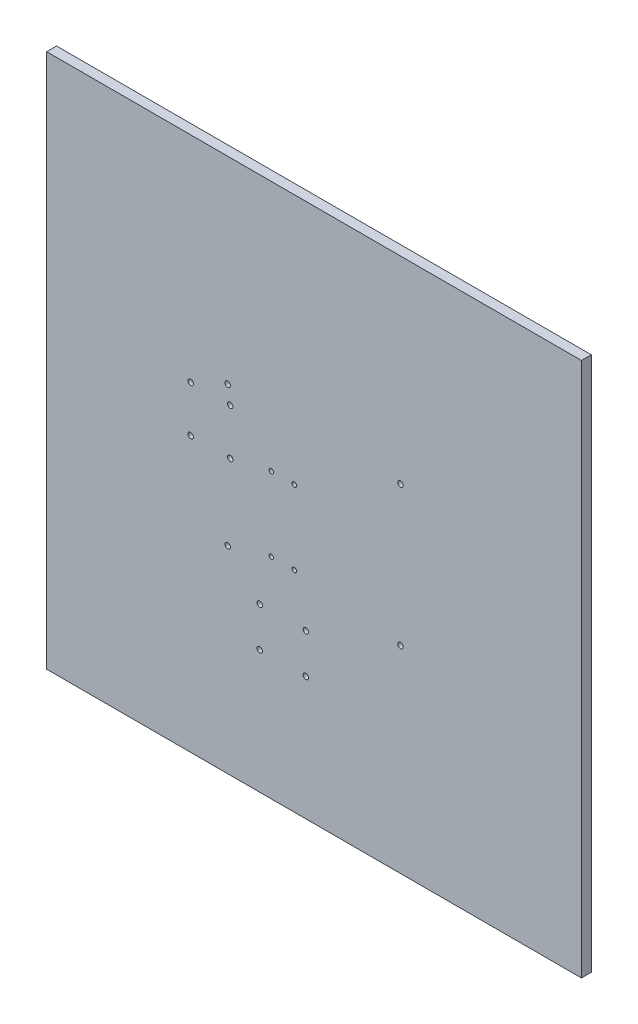
ISO-10303-21;
HEADER;
FILE_DESCRIPTION(('STEP AP214'),'2;1');
FILE_NAME('part.step','',(''),(''),'','','');
FILE_SCHEMA(('AUTOMOTIVE_DESIGN { 1 0 10303 214 1 1 1 1 }'));
ENDSEC;
DATA;
#1=APPLICATION_CONTEXT('core data for automotive mechanical design processes');
#2=APPLICATION_PROTOCOL_DEFINITION('international standard','automotive_design',2000,#1);
#3=PRODUCT_CONTEXT('',#1,'mechanical');
#4=PRODUCT('Part','Part','',(#3));
#5=PRODUCT_RELATED_PRODUCT_CATEGORY('part','',(#4));
#6=PRODUCT_DEFINITION_FORMATION('','',#4);
#7=PRODUCT_DEFINITION_CONTEXT('part definition',#1,'design');
#8=PRODUCT_DEFINITION('design','',#6,#7);
#9=PRODUCT_DEFINITION_SHAPE('','',#8);
#10=(LENGTH_UNIT() NAMED_UNIT(*) SI_UNIT(.MILLI.,.METRE.));
#11=(NAMED_UNIT(*) PLANE_ANGLE_UNIT() SI_UNIT($,.RADIAN.));
#12=(NAMED_UNIT(*) SI_UNIT($,.STERADIAN.) SOLID_ANGLE_UNIT());
#13=UNCERTAINTY_MEASURE_WITH_UNIT(LENGTH_MEASURE(1.E-05),#10,'distance_accuracy_value','');
#14=(GEOMETRIC_REPRESENTATION_CONTEXT(3) GLOBAL_UNCERTAINTY_ASSIGNED_CONTEXT((#13)) GLOBAL_UNIT_ASSIGNED_CONTEXT((#10,
#11,#12)) REPRESENTATION_CONTEXT('',''));
#15=CARTESIAN_POINT('',(0.,0.,0.));
#16=DIRECTION('',(0.,0.,1.));
#17=DIRECTION('',(1.,0.,0.));
#18=AXIS2_PLACEMENT_3D('',#15,#16,#17);
#19=CARTESIAN_POINT('',(-325.,-325.,12.));
#20=DIRECTION('',(1.,0.,0.));
#21=DIRECTION('',(0.,0.,-1.));
#22=AXIS2_PLACEMENT_3D('',#19,#20,#21);
#23=PLANE('',#22);
#24=DIRECTION('',(0.,-1.,0.));
#25=VECTOR('',#24,1.);
#26=CARTESIAN_POINT('',(-325.,-325.,0.));
#27=LINE('',#26,#25);
#28=CARTESIAN_POINT('',(-325.,325.,0.));
#29=VERTEX_POINT('',#28);
#30=CARTESIAN_POINT('',(-325.,-325.,0.));
#31=VERTEX_POINT('',#30);
#32=EDGE_CURVE('E102',#29,#31,#27,.T.);
#33=ORIENTED_EDGE('',*,*,#32,.T.);
#34=DIRECTION('',(0.,0.,-1.));
#35=VECTOR('',#34,1.);
#36=CARTESIAN_POINT('',(-325.,-325.,12.));
#37=LINE('',#36,#35);
#38=CARTESIAN_POINT('',(-325.,-325.,12.));
#39=VERTEX_POINT('',#38);
#40=EDGE_CURVE('E11',#39,#31,#37,.T.);
#41=ORIENTED_EDGE('',*,*,#40,.F.);
#42=DIRECTION('',(0.,-1.,0.));
#43=VECTOR('',#42,1.);
#44=CARTESIAN_POINT('',(-325.,-325.,12.));
#45=LINE('',#44,#43);
#46=CARTESIAN_POINT('',(-325.,325.,12.));
#47=VERTEX_POINT('',#46);
#48=EDGE_CURVE('E95',#47,#39,#45,.T.);
#49=ORIENTED_EDGE('',*,*,#48,.F.);
#50=DIRECTION('',(0.,0.,-1.));
#51=VECTOR('',#50,1.);
#52=CARTESIAN_POINT('',(-325.,325.,12.));
#53=LINE('',#52,#51);
#54=EDGE_CURVE('E99',#47,#29,#53,.T.);
#55=ORIENTED_EDGE('',*,*,#54,.T.);
#56=EDGE_LOOP('',(#33,#41,#49,#55));
#57=FACE_BOUND('',#56,.T.);
#58=ADVANCED_FACE('F41',(#57),#23,.F.);
#59=CARTESIAN_POINT('',(-325.,-325.,12.));
#60=DIRECTION('',(0.,1.,0.));
#61=DIRECTION('',(0.,0.,1.));
#62=AXIS2_PLACEMENT_3D('',#59,#60,#61);
#63=PLANE('',#62);
#64=DIRECTION('',(1.,0.,0.));
#65=VECTOR('',#64,1.);
#66=CARTESIAN_POINT('',(-325.,-325.,0.));
#67=LINE('',#66,#65);
#68=CARTESIAN_POINT('',(325.,-325.,0.));
#69=VERTEX_POINT('',#68);
#70=EDGE_CURVE('E96',#31,#69,#67,.T.);
#71=ORIENTED_EDGE('',*,*,#70,.T.);
#72=DIRECTION('',(0.,0.,-1.));
#73=VECTOR('',#72,1.);
#74=CARTESIAN_POINT('',(325.,-325.,12.));
#75=LINE('',#74,#73);
#76=CARTESIAN_POINT('',(325.,-325.,12.));
#77=VERTEX_POINT('',#76);
#78=EDGE_CURVE('E47',#77,#69,#75,.T.);
#79=ORIENTED_EDGE('',*,*,#78,.F.);
#80=DIRECTION('',(1.,0.,0.));
#81=VECTOR('',#80,1.);
#82=CARTESIAN_POINT('',(-325.,-325.,12.));
#83=LINE('',#82,#81);
#84=EDGE_CURVE('E87',#39,#77,#83,.T.);
#85=ORIENTED_EDGE('',*,*,#84,.F.);
#86=ORIENTED_EDGE('',*,*,#40,.T.);
#87=EDGE_LOOP('',(#71,#79,#85,#86));
#88=FACE_BOUND('',#87,.T.);
#89=ADVANCED_FACE('F92',(#88),#63,.F.);
#90=CARTESIAN_POINT('',(325.,-325.,12.));
#91=DIRECTION('',(-1.,0.,0.));
#92=DIRECTION('',(0.,0.,1.));
#93=AXIS2_PLACEMENT_3D('',#90,#91,#92);
#94=PLANE('',#93);
#95=DIRECTION('',(0.,1.,0.));
#96=VECTOR('',#95,1.);
#97=CARTESIAN_POINT('',(325.,-325.,0.));
#98=LINE('',#97,#96);
#99=CARTESIAN_POINT('',(325.,325.,0.));
#100=VERTEX_POINT('',#99);
#101=EDGE_CURVE('E74',#69,#100,#98,.T.);
#102=ORIENTED_EDGE('',*,*,#101,.T.);
#103=DIRECTION('',(0.,0.,-1.));
#104=VECTOR('',#103,1.);
#105=CARTESIAN_POINT('',(325.,325.,12.));
#106=LINE('',#105,#104);
#107=CARTESIAN_POINT('',(325.,325.,12.));
#108=VERTEX_POINT('',#107);
#109=EDGE_CURVE('E100',#108,#100,#106,.T.);
#110=ORIENTED_EDGE('',*,*,#109,.F.);
#111=DIRECTION('',(0.,1.,0.));
#112=VECTOR('',#111,1.);
#113=CARTESIAN_POINT('',(325.,-325.,12.));
#114=LINE('',#113,#112);
#115=EDGE_CURVE('E89',#77,#108,#114,.T.);
#116=ORIENTED_EDGE('',*,*,#115,.F.);
#117=ORIENTED_EDGE('',*,*,#78,.T.);
#118=EDGE_LOOP('',(#102,#110,#116,#117));
#119=FACE_BOUND('',#118,.T.);
#120=ADVANCED_FACE('F98',(#119),#94,.F.);
#121=CARTESIAN_POINT('',(-325.,325.,12.));
#122=DIRECTION('',(0.,-1.,0.));
#123=DIRECTION('',(0.,0.,-1.));
#124=AXIS2_PLACEMENT_3D('',#121,#122,#123);
#125=PLANE('',#124);
#126=DIRECTION('',(-1.,0.,0.));
#127=VECTOR('',#126,1.);
#128=CARTESIAN_POINT('',(-325.,325.,0.));
#129=LINE('',#128,#127);
#130=EDGE_CURVE('E78',#100,#29,#129,.T.);
#131=ORIENTED_EDGE('',*,*,#130,.T.);
#132=ORIENTED_EDGE('',*,*,#54,.F.);
#133=DIRECTION('',(-1.,0.,0.));
#134=VECTOR('',#133,1.);
#135=CARTESIAN_POINT('',(-325.,325.,12.));
#136=LINE('',#135,#134);
#137=EDGE_CURVE('E60',#108,#47,#136,.T.);
#138=ORIENTED_EDGE('',*,*,#137,.F.);
#139=ORIENTED_EDGE('',*,*,#109,.T.);
#140=EDGE_LOOP('',(#131,#132,#138,#139));
#141=FACE_BOUND('',#140,.T.);
#142=ADVANCED_FACE('F115',(#141),#125,.F.);
#143=CARTESIAN_POINT('',(0.,0.,12.));
#144=DIRECTION('',(0.,0.,-1.));
#145=DIRECTION('',(-1.,0.,0.));
#146=AXIS2_PLACEMENT_3D('',#143,#144,#145);
#147=PLANE('',#146);
#148=CARTESIAN_POINT('',(-52.,20.,12.));
#149=DIRECTION('',(0.,0.,1.));
#150=DIRECTION('',(1.,0.,0.));
#151=AXIS2_PLACEMENT_3D('',#148,#149,#150);
#152=CIRCLE('',#151,2.75);
#153=CARTESIAN_POINT('',(-49.25,20.,12.));
#154=VERTEX_POINT('',#153);
#155=EDGE_CURVE('E192',#154,#154,#152,.T.);
#156=ORIENTED_EDGE('',*,*,#155,.F.);
#157=EDGE_LOOP('',(#156));
#158=FACE_BOUND('',#157,.T.);
#159=CARTESIAN_POINT('',(-24.,-70.,12.));
#160=DIRECTION('',(0.,0.,1.));
#161=DIRECTION('',(1.,0.,0.));
#162=AXIS2_PLACEMENT_3D('',#159,#160,#161);
#163=CIRCLE('',#162,2.75);
#164=CARTESIAN_POINT('',(-21.25,-70.,12.));
#165=VERTEX_POINT('',#164);
#166=EDGE_CURVE('E200',#165,#165,#163,.T.);
#167=ORIENTED_EDGE('',*,*,#166,.F.);
#168=EDGE_LOOP('',(#167));
#169=FACE_BOUND('',#168,.T.);
#170=CARTESIAN_POINT('',(-24.,20.,12.));
#171=DIRECTION('',(0.,0.,1.));
#172=DIRECTION('',(1.,0.,0.));
#173=AXIS2_PLACEMENT_3D('',#170,#171,#172);
#174=CIRCLE('',#173,2.75);
#175=CARTESIAN_POINT('',(-21.25,20.,12.));
#176=VERTEX_POINT('',#175);
#177=EDGE_CURVE('E199',#176,#176,#174,.T.);
#178=ORIENTED_EDGE('',*,*,#177,.F.);
#179=EDGE_LOOP('',(#178));
#180=FACE_BOUND('',#179,.T.);
#181=CARTESIAN_POINT('',(-52.,-70.,12.));
#182=DIRECTION('',(0.,0.,1.));
#183=DIRECTION('',(1.,0.,0.));
#184=AXIS2_PLACEMENT_3D('',#181,#182,#183);
#185=CIRCLE('',#184,2.75);
#186=CARTESIAN_POINT('',(-49.25,-70.,12.));
#187=VERTEX_POINT('',#186);
#188=EDGE_CURVE('E188',#187,#187,#185,.T.);
#189=ORIENTED_EDGE('',*,*,#188,.F.);
#190=EDGE_LOOP('',(#189));
#191=FACE_BOUND('',#190,.T.);
#192=CARTESIAN_POINT('',(-101.942838922601,8.5,12.));
#193=DIRECTION('',(0.,0.,1.));
#194=DIRECTION('',(1.,0.,0.));
#195=AXIS2_PLACEMENT_3D('',#192,#193,#194);
#196=CIRCLE('',#195,3.3);
#197=CARTESIAN_POINT('',(-98.6428389226013,8.5,12.));
#198=VERTEX_POINT('',#197);
#199=EDGE_CURVE('E136',#198,#198,#196,.T.);
#200=ORIENTED_EDGE('',*,*,#199,.F.);
#201=EDGE_LOOP('',(#200));
#202=FACE_BOUND('',#201,.T.);
#203=CARTESIAN_POINT('',(-149.942838922601,64.5,12.));
#204=DIRECTION('',(0.,0.,1.));
#205=DIRECTION('',(1.,0.,0.));
#206=AXIS2_PLACEMENT_3D('',#203,#204,#205);
#207=CIRCLE('',#206,3.3);
#208=CARTESIAN_POINT('',(-146.642838922601,64.5,12.));
#209=VERTEX_POINT('',#208);
#210=EDGE_CURVE('E151',#209,#209,#207,.T.);
#211=ORIENTED_EDGE('',*,*,#210,.F.);
#212=EDGE_LOOP('',(#211));
#213=FACE_BOUND('',#212,.T.);
#214=CARTESIAN_POINT('',(-101.942838922601,64.5,12.));
#215=DIRECTION('',(0.,0.,1.));
#216=DIRECTION('',(1.,0.,0.));
#217=AXIS2_PLACEMENT_3D('',#214,#215,#216);
#218=CIRCLE('',#217,3.3);
#219=CARTESIAN_POINT('',(-98.6428389226013,64.5,12.));
#220=VERTEX_POINT('',#219);
#221=EDGE_CURVE('E155',#220,#220,#218,.T.);
#222=ORIENTED_EDGE('',*,*,#221,.F.);
#223=EDGE_LOOP('',(#222));
#224=FACE_BOUND('',#223,.T.);
#225=CARTESIAN_POINT('',(-10.,-174.995245401948,12.));
#226=DIRECTION('',(0.,0.,1.));
#227=DIRECTION('',(1.,0.,0.));
#228=AXIS2_PLACEMENT_3D('',#225,#226,#227);
#229=CIRCLE('',#228,3.3);
#230=CARTESIAN_POINT('',(-6.7,-174.995245401948,12.));
#231=VERTEX_POINT('',#230);
#232=EDGE_CURVE('E162',#231,#231,#229,.T.);
#233=ORIENTED_EDGE('',*,*,#232,.F.);
#234=EDGE_LOOP('',(#233));
#235=FACE_BOUND('',#234,.T.);
#236=CARTESIAN_POINT('',(-105.,85.,12.));
#237=DIRECTION('',(0.,0.,1.));
#238=DIRECTION('',(1.,0.,0.));
#239=AXIS2_PLACEMENT_3D('',#236,#237,#238);
#240=CIRCLE('',#239,3.3);
#241=CARTESIAN_POINT('',(-101.7,85.,12.));
#242=VERTEX_POINT('',#241);
#243=EDGE_CURVE('E123',#242,#242,#240,.T.);
#244=ORIENTED_EDGE('',*,*,#243,.F.);
#245=EDGE_LOOP('',(#244));
#246=FACE_BOUND('',#245,.T.);
#247=CARTESIAN_POINT('',(105.,-85.,12.));
#248=DIRECTION('',(0.,0.,1.));
#249=DIRECTION('',(1.,0.,0.));
#250=AXIS2_PLACEMENT_3D('',#247,#248,#249);
#251=CIRCLE('',#250,3.3);
#252=CARTESIAN_POINT('',(108.3,-85.,12.));
#253=VERTEX_POINT('',#252);
#254=EDGE_CURVE('E130',#253,#253,#251,.T.);
#255=ORIENTED_EDGE('',*,*,#254,.F.);
#256=EDGE_LOOP('',(#255));
#257=FACE_BOUND('',#256,.T.);
#258=CARTESIAN_POINT('',(105.,85.,12.));
#259=DIRECTION('',(0.,0.,1.));
#260=DIRECTION('',(1.,0.,0.));
#261=AXIS2_PLACEMENT_3D('',#258,#259,#260);
#262=CIRCLE('',#261,3.3);
#263=CARTESIAN_POINT('',(108.3,85.,12.));
#264=VERTEX_POINT('',#263);
#265=EDGE_CURVE('E126',#264,#264,#262,.T.);
#266=ORIENTED_EDGE('',*,*,#265,.F.);
#267=EDGE_LOOP('',(#266));
#268=FACE_BOUND('',#267,.T.);
#269=CARTESIAN_POINT('',(-149.942838922601,8.5,12.));
#270=DIRECTION('',(0.,0.,1.));
#271=DIRECTION('',(1.,0.,0.));
#272=AXIS2_PLACEMENT_3D('',#269,#270,#271);
#273=CIRCLE('',#272,3.3);
#274=CARTESIAN_POINT('',(-146.642838922601,8.5,12.));
#275=VERTEX_POINT('',#274);
#276=EDGE_CURVE('E140',#275,#275,#273,.T.);
#277=ORIENTED_EDGE('',*,*,#276,.F.);
#278=EDGE_LOOP('',(#277));
#279=FACE_BOUND('',#278,.T.);
#280=CARTESIAN_POINT('',(-66.,-126.995245401948,12.));
#281=DIRECTION('',(0.,0.,1.));
#282=DIRECTION('',(1.,0.,0.));
#283=AXIS2_PLACEMENT_3D('',#280,#281,#282);
#284=CIRCLE('',#283,3.3);
#285=CARTESIAN_POINT('',(-62.7,-126.995245401948,12.));
#286=VERTEX_POINT('',#285);
#287=EDGE_CURVE('E178',#286,#286,#284,.T.);
#288=ORIENTED_EDGE('',*,*,#287,.F.);
#289=EDGE_LOOP('',(#288));
#290=FACE_BOUND('',#289,.T.);
#291=CARTESIAN_POINT('',(-66.,-174.995245401948,12.));
#292=DIRECTION('',(0.,0.,1.));
#293=DIRECTION('',(1.,0.,0.));
#294=AXIS2_PLACEMENT_3D('',#291,#292,#293);
#295=CIRCLE('',#294,3.3);
#296=CARTESIAN_POINT('',(-62.7,-174.995245401948,12.));
#297=VERTEX_POINT('',#296);
#298=EDGE_CURVE('E173',#297,#297,#295,.T.);
#299=ORIENTED_EDGE('',*,*,#298,.F.);
#300=EDGE_LOOP('',(#299));
#301=FACE_BOUND('',#300,.T.);
#302=CARTESIAN_POINT('',(-10.,-126.995245401948,12.));
#303=DIRECTION('',(0.,0.,1.));
#304=DIRECTION('',(1.,0.,0.));
#305=AXIS2_PLACEMENT_3D('',#302,#303,#304);
#306=CIRCLE('',#305,3.3);
#307=CARTESIAN_POINT('',(-6.7,-126.995245401948,12.));
#308=VERTEX_POINT('',#307);
#309=EDGE_CURVE('E163',#308,#308,#306,.T.);
#310=ORIENTED_EDGE('',*,*,#309,.F.);
#311=EDGE_LOOP('',(#310));
#312=FACE_BOUND('',#311,.T.);
#313=CARTESIAN_POINT('',(-105.,-85.,12.));
#314=DIRECTION('',(0.,0.,1.));
#315=DIRECTION('',(1.,0.,0.));
#316=AXIS2_PLACEMENT_3D('',#313,#314,#315);
#317=CIRCLE('',#316,3.3);
#318=CARTESIAN_POINT('',(-101.7,-85.,12.));
#319=VERTEX_POINT('',#318);
#320=EDGE_CURVE('E119',#319,#319,#317,.T.);
#321=ORIENTED_EDGE('',*,*,#320,.F.);
#322=EDGE_LOOP('',(#321));
#323=FACE_BOUND('',#322,.T.);
#324=ORIENTED_EDGE('',*,*,#48,.T.);
#325=ORIENTED_EDGE('',*,*,#84,.T.);
#326=ORIENTED_EDGE('',*,*,#115,.T.);
#327=ORIENTED_EDGE('',*,*,#137,.T.);
#328=EDGE_LOOP('',(#324,#325,#326,#327));
#329=FACE_BOUND('',#328,.T.);
#330=ADVANCED_FACE('F86',(#158,#169,#180,#191,#202,#213,#224,#235,#246,#257,#268,#279,#290,#301,
#312,#323,#329),#147,.F.);
#331=CARTESIAN_POINT('',(0.,0.,0.));
#332=DIRECTION('',(0.,0.,-1.));
#333=DIRECTION('',(-1.,0.,0.));
#334=AXIS2_PLACEMENT_3D('',#331,#332,#333);
#335=PLANE('',#334);
#336=CARTESIAN_POINT('',(-52.,20.,0.));
#337=DIRECTION('',(0.,0.,1.));
#338=DIRECTION('',(1.,0.,0.));
#339=AXIS2_PLACEMENT_3D('',#336,#337,#338);
#340=CIRCLE('',#339,2.75);
#341=CARTESIAN_POINT('',(-49.25,20.,0.));
#342=VERTEX_POINT('',#341);
#343=EDGE_CURVE('E201',#342,#342,#340,.T.);
#344=ORIENTED_EDGE('',*,*,#343,.T.);
#345=EDGE_LOOP('',(#344));
#346=FACE_BOUND('',#345,.T.);
#347=CARTESIAN_POINT('',(-24.,-70.,0.));
#348=DIRECTION('',(0.,0.,1.));
#349=DIRECTION('',(1.,0.,0.));
#350=AXIS2_PLACEMENT_3D('',#347,#348,#349);
#351=CIRCLE('',#350,2.75);
#352=CARTESIAN_POINT('',(-21.25,-70.,0.));
#353=VERTEX_POINT('',#352);
#354=EDGE_CURVE('E198',#353,#353,#351,.T.);
#355=ORIENTED_EDGE('',*,*,#354,.T.);
#356=EDGE_LOOP('',(#355));
#357=FACE_BOUND('',#356,.T.);
#358=CARTESIAN_POINT('',(-24.,20.,0.));
#359=DIRECTION('',(0.,0.,1.));
#360=DIRECTION('',(1.,0.,0.));
#361=AXIS2_PLACEMENT_3D('',#358,#359,#360);
#362=CIRCLE('',#361,2.75);
#363=CARTESIAN_POINT('',(-21.25,20.,0.));
#364=VERTEX_POINT('',#363);
#365=EDGE_CURVE('E208',#364,#364,#362,.T.);
#366=ORIENTED_EDGE('',*,*,#365,.T.);
#367=EDGE_LOOP('',(#366));
#368=FACE_BOUND('',#367,.T.);
#369=CARTESIAN_POINT('',(-52.,-70.,0.));
#370=DIRECTION('',(0.,0.,1.));
#371=DIRECTION('',(1.,0.,0.));
#372=AXIS2_PLACEMENT_3D('',#369,#370,#371);
#373=CIRCLE('',#372,2.75);
#374=CARTESIAN_POINT('',(-49.25,-70.,0.));
#375=VERTEX_POINT('',#374);
#376=EDGE_CURVE('E190',#375,#375,#373,.T.);
#377=ORIENTED_EDGE('',*,*,#376,.T.);
#378=EDGE_LOOP('',(#377));
#379=FACE_BOUND('',#378,.T.);
#380=CARTESIAN_POINT('',(-101.942838922601,8.5,0.));
#381=DIRECTION('',(0.,0.,1.));
#382=DIRECTION('',(1.,0.,0.));
#383=AXIS2_PLACEMENT_3D('',#380,#381,#382);
#384=CIRCLE('',#383,3.3);
#385=CARTESIAN_POINT('',(-98.6428389226013,8.5,0.));
#386=VERTEX_POINT('',#385);
#387=EDGE_CURVE('E154',#386,#386,#384,.T.);
#388=ORIENTED_EDGE('',*,*,#387,.T.);
#389=EDGE_LOOP('',(#388));
#390=FACE_BOUND('',#389,.T.);
#391=CARTESIAN_POINT('',(-149.942838922601,64.5,0.));
#392=DIRECTION('',(0.,0.,1.));
#393=DIRECTION('',(1.,0.,0.));
#394=AXIS2_PLACEMENT_3D('',#391,#392,#393);
#395=CIRCLE('',#394,3.3);
#396=CARTESIAN_POINT('',(-146.642838922601,64.5,0.));
#397=VERTEX_POINT('',#396);
#398=EDGE_CURVE('E146',#397,#397,#395,.T.);
#399=ORIENTED_EDGE('',*,*,#398,.T.);
#400=EDGE_LOOP('',(#399));
#401=FACE_BOUND('',#400,.T.);
#402=CARTESIAN_POINT('',(-101.942838922601,64.5,0.));
#403=DIRECTION('',(0.,0.,1.));
#404=DIRECTION('',(1.,0.,0.));
#405=AXIS2_PLACEMENT_3D('',#402,#403,#404);
#406=CIRCLE('',#405,3.3);
#407=CARTESIAN_POINT('',(-98.6428389226013,64.5,0.));
#408=VERTEX_POINT('',#407);
#409=EDGE_CURVE('E170',#408,#408,#406,.T.);
#410=ORIENTED_EDGE('',*,*,#409,.T.);
#411=EDGE_LOOP('',(#410));
#412=FACE_BOUND('',#411,.T.);
#413=CARTESIAN_POINT('',(-10.,-174.995245401948,0.));
#414=DIRECTION('',(0.,0.,1.));
#415=DIRECTION('',(1.,0.,0.));
#416=AXIS2_PLACEMENT_3D('',#413,#414,#415);
#417=CIRCLE('',#416,3.3);
#418=CARTESIAN_POINT('',(-6.7,-174.995245401948,0.));
#419=VERTEX_POINT('',#418);
#420=EDGE_CURVE('E159',#419,#419,#417,.T.);
#421=ORIENTED_EDGE('',*,*,#420,.T.);
#422=EDGE_LOOP('',(#421));
#423=FACE_BOUND('',#422,.T.);
#424=CARTESIAN_POINT('',(-105.,85.,0.));
#425=DIRECTION('',(0.,0.,1.));
#426=DIRECTION('',(1.,0.,0.));
#427=AXIS2_PLACEMENT_3D('',#424,#425,#426);
#428=CIRCLE('',#427,3.3);
#429=CARTESIAN_POINT('',(-101.7,85.,0.));
#430=VERTEX_POINT('',#429);
#431=EDGE_CURVE('E132',#430,#430,#428,.T.);
#432=ORIENTED_EDGE('',*,*,#431,.T.);
#433=EDGE_LOOP('',(#432));
#434=FACE_BOUND('',#433,.T.);
#435=CARTESIAN_POINT('',(105.,-85.,0.));
#436=DIRECTION('',(0.,0.,1.));
#437=DIRECTION('',(1.,0.,0.));
#438=AXIS2_PLACEMENT_3D('',#435,#436,#437);
#439=CIRCLE('',#438,3.3);
#440=CARTESIAN_POINT('',(108.3,-85.,0.));
#441=VERTEX_POINT('',#440);
#442=EDGE_CURVE('E125',#441,#441,#439,.T.);
#443=ORIENTED_EDGE('',*,*,#442,.T.);
#444=EDGE_LOOP('',(#443));
#445=FACE_BOUND('',#444,.T.);
#446=CARTESIAN_POINT('',(105.,85.,0.));
#447=DIRECTION('',(0.,0.,1.));
#448=DIRECTION('',(1.,0.,0.));
#449=AXIS2_PLACEMENT_3D('',#446,#447,#448);
#450=CIRCLE('',#449,3.3);
#451=CARTESIAN_POINT('',(108.3,85.,0.));
#452=VERTEX_POINT('',#451);
#453=EDGE_CURVE('E141',#452,#452,#450,.T.);
#454=ORIENTED_EDGE('',*,*,#453,.T.);
#455=EDGE_LOOP('',(#454));
#456=FACE_BOUND('',#455,.T.);
#457=CARTESIAN_POINT('',(-149.942838922601,8.5,0.));
#458=DIRECTION('',(0.,0.,1.));
#459=DIRECTION('',(1.,0.,0.));
#460=AXIS2_PLACEMENT_3D('',#457,#458,#459);
#461=CIRCLE('',#460,3.3);
#462=CARTESIAN_POINT('',(-146.642838922601,8.5,0.));
#463=VERTEX_POINT('',#462);
#464=EDGE_CURVE('E138',#463,#463,#461,.T.);
#465=ORIENTED_EDGE('',*,*,#464,.T.);
#466=EDGE_LOOP('',(#465));
#467=FACE_BOUND('',#466,.T.);
#468=CARTESIAN_POINT('',(-66.,-126.995245401948,0.));
#469=DIRECTION('',(0.,0.,1.));
#470=DIRECTION('',(1.,0.,0.));
#471=AXIS2_PLACEMENT_3D('',#468,#469,#470);
#472=CIRCLE('',#471,3.3);
#473=CARTESIAN_POINT('',(-62.7,-126.995245401948,0.));
#474=VERTEX_POINT('',#473);
#475=EDGE_CURVE('E184',#474,#474,#472,.T.);
#476=ORIENTED_EDGE('',*,*,#475,.T.);
#477=EDGE_LOOP('',(#476));
#478=FACE_BOUND('',#477,.T.);
#479=CARTESIAN_POINT('',(-66.,-174.995245401948,0.));
#480=DIRECTION('',(0.,0.,1.));
#481=DIRECTION('',(1.,0.,0.));
#482=AXIS2_PLACEMENT_3D('',#479,#480,#481);
#483=CIRCLE('',#482,3.3);
#484=CARTESIAN_POINT('',(-62.7,-174.995245401948,0.));
#485=VERTEX_POINT('',#484);
#486=EDGE_CURVE('E175',#485,#485,#483,.T.);
#487=ORIENTED_EDGE('',*,*,#486,.T.);
#488=EDGE_LOOP('',(#487));
#489=FACE_BOUND('',#488,.T.);
#490=CARTESIAN_POINT('',(-10.,-126.995245401948,0.));
#491=DIRECTION('',(0.,0.,1.));
#492=DIRECTION('',(1.,0.,0.));
#493=AXIS2_PLACEMENT_3D('',#490,#491,#492);
#494=CIRCLE('',#493,3.3);
#495=CARTESIAN_POINT('',(-6.7,-126.995245401948,0.));
#496=VERTEX_POINT('',#495);
#497=EDGE_CURVE('E180',#496,#496,#494,.T.);
#498=ORIENTED_EDGE('',*,*,#497,.T.);
#499=EDGE_LOOP('',(#498));
#500=FACE_BOUND('',#499,.T.);
#501=CARTESIAN_POINT('',(-105.,-85.,0.));
#502=DIRECTION('',(0.,0.,1.));
#503=DIRECTION('',(1.,0.,0.));
#504=AXIS2_PLACEMENT_3D('',#501,#502,#503);
#505=CIRCLE('',#504,3.3);
#506=CARTESIAN_POINT('',(-101.7,-85.,0.));
#507=VERTEX_POINT('',#506);
#508=EDGE_CURVE('E110',#507,#507,#505,.T.);
#509=ORIENTED_EDGE('',*,*,#508,.T.);
#510=EDGE_LOOP('',(#509));
#511=FACE_BOUND('',#510,.T.);
#512=ORIENTED_EDGE('',*,*,#32,.F.);
#513=ORIENTED_EDGE('',*,*,#130,.F.);
#514=ORIENTED_EDGE('',*,*,#101,.F.);
#515=ORIENTED_EDGE('',*,*,#70,.F.);
#516=EDGE_LOOP('',(#512,#513,#514,#515));
#517=FACE_BOUND('',#516,.T.);
#518=ADVANCED_FACE('F113',(#346,#357,#368,#379,#390,#401,#412,#423,#434,#445,#456,#467,#478,
#489,#500,#511,#517),#335,.T.);
#519=CARTESIAN_POINT('',(-105.,-85.,0.));
#520=DIRECTION('',(0.,0.,1.));
#521=DIRECTION('',(1.,0.,0.));
#522=AXIS2_PLACEMENT_3D('',#519,#520,#521);
#523=CYLINDRICAL_SURFACE('',#522,3.3);
#524=ORIENTED_EDGE('',*,*,#508,.F.);
#525=EDGE_LOOP('',(#524));
#526=FACE_BOUND('',#525,.T.);
#527=ORIENTED_EDGE('',*,*,#320,.T.);
#528=EDGE_LOOP('',(#527));
#529=FACE_BOUND('',#528,.T.);
#530=ADVANCED_FACE('F248',(#526,#529),#523,.F.);
#531=CARTESIAN_POINT('',(-10.,-126.995245401948,0.));
#532=DIRECTION('',(0.,0.,1.));
#533=DIRECTION('',(1.,0.,0.));
#534=AXIS2_PLACEMENT_3D('',#531,#532,#533);
#535=CYLINDRICAL_SURFACE('',#534,3.3);
#536=ORIENTED_EDGE('',*,*,#497,.F.);
#537=EDGE_LOOP('',(#536));
#538=FACE_BOUND('',#537,.T.);
#539=ORIENTED_EDGE('',*,*,#309,.T.);
#540=EDGE_LOOP('',(#539));
#541=FACE_BOUND('',#540,.T.);
#542=ADVANCED_FACE('F247',(#538,#541),#535,.F.);
#543=CARTESIAN_POINT('',(-66.,-174.995245401948,0.));
#544=DIRECTION('',(0.,0.,1.));
#545=DIRECTION('',(1.,0.,0.));
#546=AXIS2_PLACEMENT_3D('',#543,#544,#545);
#547=CYLINDRICAL_SURFACE('',#546,3.3);
#548=ORIENTED_EDGE('',*,*,#486,.F.);
#549=EDGE_LOOP('',(#548));
#550=FACE_BOUND('',#549,.T.);
#551=ORIENTED_EDGE('',*,*,#298,.T.);
#552=EDGE_LOOP('',(#551));
#553=FACE_BOUND('',#552,.T.);
#554=ADVANCED_FACE('F254',(#550,#553),#547,.F.);
#555=CARTESIAN_POINT('',(-66.,-126.995245401948,0.));
#556=DIRECTION('',(0.,0.,1.));
#557=DIRECTION('',(1.,0.,0.));
#558=AXIS2_PLACEMENT_3D('',#555,#556,#557);
#559=CYLINDRICAL_SURFACE('',#558,3.3);
#560=ORIENTED_EDGE('',*,*,#475,.F.);
#561=EDGE_LOOP('',(#560));
#562=FACE_BOUND('',#561,.T.);
#563=ORIENTED_EDGE('',*,*,#287,.T.);
#564=EDGE_LOOP('',(#563));
#565=FACE_BOUND('',#564,.T.);
#566=ADVANCED_FACE('F316',(#562,#565),#559,.F.);
#567=CARTESIAN_POINT('',(-149.942838922601,8.5,0.));
#568=DIRECTION('',(0.,0.,1.));
#569=DIRECTION('',(1.,0.,0.));
#570=AXIS2_PLACEMENT_3D('',#567,#568,#569);
#571=CYLINDRICAL_SURFACE('',#570,3.3);
#572=ORIENTED_EDGE('',*,*,#464,.F.);
#573=EDGE_LOOP('',(#572));
#574=FACE_BOUND('',#573,.T.);
#575=ORIENTED_EDGE('',*,*,#276,.T.);
#576=EDGE_LOOP('',(#575));
#577=FACE_BOUND('',#576,.T.);
#578=ADVANCED_FACE('F324',(#574,#577),#571,.F.);
#579=CARTESIAN_POINT('',(105.,85.,0.));
#580=DIRECTION('',(0.,0.,1.));
#581=DIRECTION('',(1.,0.,0.));
#582=AXIS2_PLACEMENT_3D('',#579,#580,#581);
#583=CYLINDRICAL_SURFACE('',#582,3.3);
#584=ORIENTED_EDGE('',*,*,#453,.F.);
#585=EDGE_LOOP('',(#584));
#586=FACE_BOUND('',#585,.T.);
#587=ORIENTED_EDGE('',*,*,#265,.T.);
#588=EDGE_LOOP('',(#587));
#589=FACE_BOUND('',#588,.T.);
#590=ADVANCED_FACE('F331',(#586,#589),#583,.F.);
#591=CARTESIAN_POINT('',(105.,-85.,0.));
#592=DIRECTION('',(0.,0.,1.));
#593=DIRECTION('',(1.,0.,0.));
#594=AXIS2_PLACEMENT_3D('',#591,#592,#593);
#595=CYLINDRICAL_SURFACE('',#594,3.3);
#596=ORIENTED_EDGE('',*,*,#442,.F.);
#597=EDGE_LOOP('',(#596));
#598=FACE_BOUND('',#597,.T.);
#599=ORIENTED_EDGE('',*,*,#254,.T.);
#600=EDGE_LOOP('',(#599));
#601=FACE_BOUND('',#600,.T.);
#602=ADVANCED_FACE('F342',(#598,#601),#595,.F.);
#603=CARTESIAN_POINT('',(-105.,85.,0.));
#604=DIRECTION('',(0.,0.,1.));
#605=DIRECTION('',(1.,0.,0.));
#606=AXIS2_PLACEMENT_3D('',#603,#604,#605);
#607=CYLINDRICAL_SURFACE('',#606,3.3);
#608=ORIENTED_EDGE('',*,*,#431,.F.);
#609=EDGE_LOOP('',(#608));
#610=FACE_BOUND('',#609,.T.);
#611=ORIENTED_EDGE('',*,*,#243,.T.);
#612=EDGE_LOOP('',(#611));
#613=FACE_BOUND('',#612,.T.);
#614=ADVANCED_FACE('F355',(#610,#613),#607,.F.);
#615=CARTESIAN_POINT('',(-10.,-174.995245401948,0.));
#616=DIRECTION('',(0.,0.,1.));
#617=DIRECTION('',(1.,0.,0.));
#618=AXIS2_PLACEMENT_3D('',#615,#616,#617);
#619=CYLINDRICAL_SURFACE('',#618,3.3);
#620=ORIENTED_EDGE('',*,*,#420,.F.);
#621=EDGE_LOOP('',(#620));
#622=FACE_BOUND('',#621,.T.);
#623=ORIENTED_EDGE('',*,*,#232,.T.);
#624=EDGE_LOOP('',(#623));
#625=FACE_BOUND('',#624,.T.);
#626=ADVANCED_FACE('F356',(#622,#625),#619,.F.);
#627=CARTESIAN_POINT('',(-101.942838922601,64.5,0.));
#628=DIRECTION('',(0.,0.,1.));
#629=DIRECTION('',(1.,0.,0.));
#630=AXIS2_PLACEMENT_3D('',#627,#628,#629);
#631=CYLINDRICAL_SURFACE('',#630,3.3);
#632=ORIENTED_EDGE('',*,*,#409,.F.);
#633=EDGE_LOOP('',(#632));
#634=FACE_BOUND('',#633,.T.);
#635=ORIENTED_EDGE('',*,*,#221,.T.);
#636=EDGE_LOOP('',(#635));
#637=FACE_BOUND('',#636,.T.);
#638=ADVANCED_FACE('F369',(#634,#637),#631,.F.);
#639=CARTESIAN_POINT('',(-149.942838922601,64.5,0.));
#640=DIRECTION('',(0.,0.,1.));
#641=DIRECTION('',(1.,0.,0.));
#642=AXIS2_PLACEMENT_3D('',#639,#640,#641);
#643=CYLINDRICAL_SURFACE('',#642,3.3);
#644=ORIENTED_EDGE('',*,*,#398,.F.);
#645=EDGE_LOOP('',(#644));
#646=FACE_BOUND('',#645,.T.);
#647=ORIENTED_EDGE('',*,*,#210,.T.);
#648=EDGE_LOOP('',(#647));
#649=FACE_BOUND('',#648,.T.);
#650=ADVANCED_FACE('F378',(#646,#649),#643,.F.);
#651=CARTESIAN_POINT('',(-101.942838922601,8.5,0.));
#652=DIRECTION('',(0.,0.,1.));
#653=DIRECTION('',(1.,0.,0.));
#654=AXIS2_PLACEMENT_3D('',#651,#652,#653);
#655=CYLINDRICAL_SURFACE('',#654,3.3);
#656=ORIENTED_EDGE('',*,*,#387,.F.);
#657=EDGE_LOOP('',(#656));
#658=FACE_BOUND('',#657,.T.);
#659=ORIENTED_EDGE('',*,*,#199,.T.);
#660=EDGE_LOOP('',(#659));
#661=FACE_BOUND('',#660,.T.);
#662=ADVANCED_FACE('F390',(#658,#661),#655,.F.);
#663=CARTESIAN_POINT('',(-52.,-70.,0.));
#664=DIRECTION('',(0.,0.,1.));
#665=DIRECTION('',(1.,0.,0.));
#666=AXIS2_PLACEMENT_3D('',#663,#664,#665);
#667=CYLINDRICAL_SURFACE('',#666,2.75);
#668=ORIENTED_EDGE('',*,*,#376,.F.);
#669=EDGE_LOOP('',(#668));
#670=FACE_BOUND('',#669,.T.);
#671=ORIENTED_EDGE('',*,*,#188,.T.);
#672=EDGE_LOOP('',(#671));
#673=FACE_BOUND('',#672,.T.);
#674=ADVANCED_FACE('F398',(#670,#673),#667,.F.);
#675=CARTESIAN_POINT('',(-24.,20.,0.));
#676=DIRECTION('',(0.,0.,1.));
#677=DIRECTION('',(1.,0.,0.));
#678=AXIS2_PLACEMENT_3D('',#675,#676,#677);
#679=CYLINDRICAL_SURFACE('',#678,2.75);
#680=ORIENTED_EDGE('',*,*,#365,.F.);
#681=EDGE_LOOP('',(#680));
#682=FACE_BOUND('',#681,.T.);
#683=ORIENTED_EDGE('',*,*,#177,.T.);
#684=EDGE_LOOP('',(#683));
#685=FACE_BOUND('',#684,.T.);
#686=ADVANCED_FACE('F212',(#682,#685),#679,.F.);
#687=CARTESIAN_POINT('',(-24.,-70.,0.));
#688=DIRECTION('',(0.,0.,1.));
#689=DIRECTION('',(1.,0.,0.));
#690=AXIS2_PLACEMENT_3D('',#687,#688,#689);
#691=CYLINDRICAL_SURFACE('',#690,2.75);
#692=ORIENTED_EDGE('',*,*,#354,.F.);
#693=EDGE_LOOP('',(#692));
#694=FACE_BOUND('',#693,.T.);
#695=ORIENTED_EDGE('',*,*,#166,.T.);
#696=EDGE_LOOP('',(#695));
#697=FACE_BOUND('',#696,.T.);
#698=ADVANCED_FACE('F412',(#694,#697),#691,.F.);
#699=CARTESIAN_POINT('',(-52.,20.,0.));
#700=DIRECTION('',(0.,0.,1.));
#701=DIRECTION('',(1.,0.,0.));
#702=AXIS2_PLACEMENT_3D('',#699,#700,#701);
#703=CYLINDRICAL_SURFACE('',#702,2.75);
#704=ORIENTED_EDGE('',*,*,#343,.F.);
#705=EDGE_LOOP('',(#704));
#706=FACE_BOUND('',#705,.T.);
#707=ORIENTED_EDGE('',*,*,#155,.T.);
#708=EDGE_LOOP('',(#707));
#709=FACE_BOUND('',#708,.T.);
#710=ADVANCED_FACE('F425',(#706,#709),#703,.F.);
#711=CLOSED_SHELL('',(#58,#89,#120,#142,#330,#518,#530,#542,#554,#566,#578,#590,#602,#614,#626,
#638,#650,#662,#674,#686,#698,#710));
#712=MANIFOLD_SOLID_BREP('B2',#711);
#713=ADVANCED_BREP_SHAPE_REPRESENTATION('',(#18,#712),#14);
#714=SHAPE_DEFINITION_REPRESENTATION(#9,#713);
ENDSEC;
END-ISO-10303-21;
